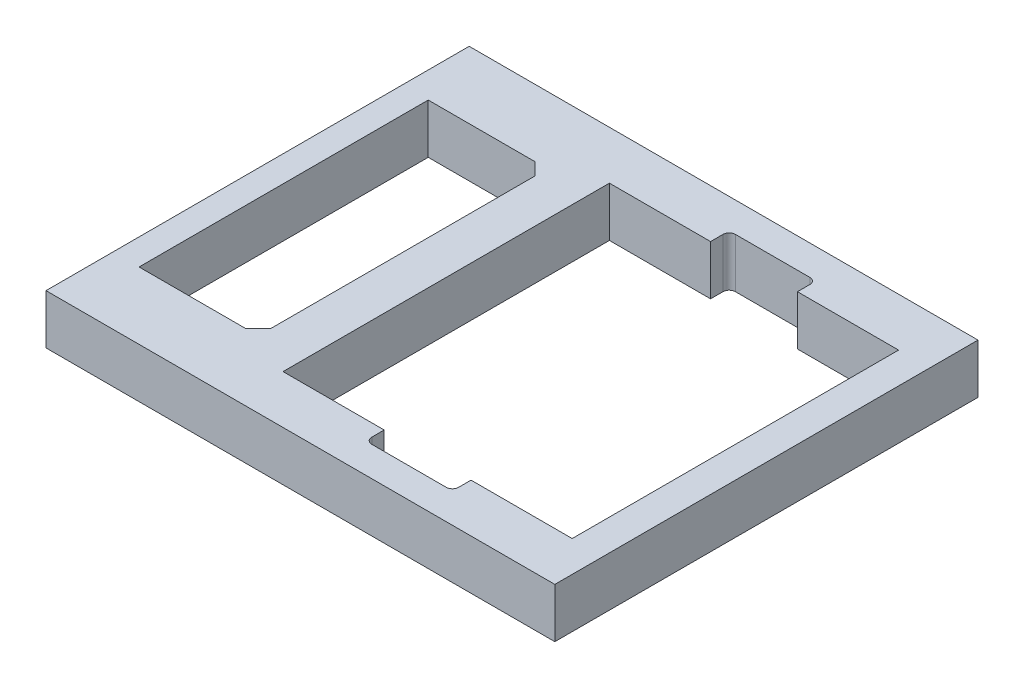
ISO-10303-21;
HEADER;
FILE_DESCRIPTION(('STEP AP214'),'2;1');
FILE_NAME('part.step','',(''),(''),'','','');
FILE_SCHEMA(('AUTOMOTIVE_DESIGN { 1 0 10303 214 1 1 1 1 }'));
ENDSEC;
DATA;
#1=APPLICATION_CONTEXT('core data for automotive mechanical design processes');
#2=APPLICATION_PROTOCOL_DEFINITION('international standard','automotive_design',2000,#1);
#3=PRODUCT_CONTEXT('',#1,'mechanical');
#4=PRODUCT('Part','Part','',(#3));
#5=PRODUCT_RELATED_PRODUCT_CATEGORY('part','',(#4));
#6=PRODUCT_DEFINITION_FORMATION('','',#4);
#7=PRODUCT_DEFINITION_CONTEXT('part definition',#1,'design');
#8=PRODUCT_DEFINITION('design','',#6,#7);
#9=PRODUCT_DEFINITION_SHAPE('','',#8);
#10=(LENGTH_UNIT() NAMED_UNIT(*) SI_UNIT(.MILLI.,.METRE.));
#11=(NAMED_UNIT(*) PLANE_ANGLE_UNIT() SI_UNIT($,.RADIAN.));
#12=(NAMED_UNIT(*) SI_UNIT($,.STERADIAN.) SOLID_ANGLE_UNIT());
#13=UNCERTAINTY_MEASURE_WITH_UNIT(LENGTH_MEASURE(1.E-05),#10,'distance_accuracy_value','');
#14=(GEOMETRIC_REPRESENTATION_CONTEXT(3) GLOBAL_UNCERTAINTY_ASSIGNED_CONTEXT((#13)) GLOBAL_UNIT_ASSIGNED_CONTEXT((#10,
#11,#12)) REPRESENTATION_CONTEXT('',''));
#15=CARTESIAN_POINT('',(0.,0.,0.));
#16=DIRECTION('',(0.,0.,1.));
#17=DIRECTION('',(1.,0.,0.));
#18=AXIS2_PLACEMENT_3D('',#15,#16,#17);
#19=CARTESIAN_POINT('',(0.,40.,0.));
#20=DIRECTION('',(0.,-1.,0.));
#21=DIRECTION('',(0.,0.,-1.));
#22=AXIS2_PLACEMENT_3D('',#19,#20,#21);
#23=PLANE('',#22);
#24=DIRECTION('',(0.,0.,1.));
#25=VECTOR('',#24,1.);
#26=CARTESIAN_POINT('',(-184.,40.,116.5));
#27=LINE('',#26,#25);
#28=CARTESIAN_POINT('',(-184.,40.,-116.5));
#29=VERTEX_POINT('',#28);
#30=CARTESIAN_POINT('',(-184.,40.,116.5));
#31=VERTEX_POINT('',#30);
#32=EDGE_CURVE('E327',#29,#31,#27,.T.);
#33=ORIENTED_EDGE('',*,*,#32,.F.);
#34=DIRECTION('',(-1.,0.,0.));
#35=VECTOR('',#34,1.);
#36=CARTESIAN_POINT('',(-184.,40.,-116.5));
#37=LINE('',#36,#35);
#38=CARTESIAN_POINT('',(-98.,40.,-116.5));
#39=VERTEX_POINT('',#38);
#40=EDGE_CURVE('E339',#39,#29,#37,.T.);
#41=ORIENTED_EDGE('',*,*,#40,.F.);
#42=DIRECTION('',(-0.707106781186547,0.,-0.707106781186547));
#43=VECTOR('',#42,1.);
#44=CARTESIAN_POINT('',(-98.,40.,-116.5));
#45=LINE('',#44,#43);
#46=CARTESIAN_POINT('',(-88.,40.,-106.5));
#47=VERTEX_POINT('',#46);
#48=EDGE_CURVE('E336',#47,#39,#45,.T.);
#49=ORIENTED_EDGE('',*,*,#48,.F.);
#50=DIRECTION('',(0.,0.,-1.));
#51=VECTOR('',#50,1.);
#52=CARTESIAN_POINT('',(-88.,40.,106.5));
#53=LINE('',#52,#51);
#54=CARTESIAN_POINT('',(-88.,40.,106.5));
#55=VERTEX_POINT('',#54);
#56=EDGE_CURVE('E334',#55,#47,#53,.T.);
#57=ORIENTED_EDGE('',*,*,#56,.F.);
#58=DIRECTION('',(0.707106781186547,0.,-0.707106781186547));
#59=VECTOR('',#58,1.);
#60=CARTESIAN_POINT('',(-98.,40.,116.5));
#61=LINE('',#60,#59);
#62=CARTESIAN_POINT('',(-98.,40.,116.5));
#63=VERTEX_POINT('',#62);
#64=EDGE_CURVE('E332',#63,#55,#61,.T.);
#65=ORIENTED_EDGE('',*,*,#64,.F.);
#66=DIRECTION('',(1.,0.,0.));
#67=VECTOR('',#66,1.);
#68=CARTESIAN_POINT('',(-184.,40.,116.5));
#69=LINE('',#68,#67);
#70=EDGE_CURVE('E329',#31,#63,#69,.T.);
#71=ORIENTED_EDGE('',*,*,#70,.F.);
#72=EDGE_LOOP('',(#33,#41,#49,#57,#65,#71));
#73=FACE_BOUND('',#72,.T.);
#74=DIRECTION('',(0.,0.,-1.));
#75=VECTOR('',#74,1.);
#76=CARTESIAN_POINT('',(205.,40.,170.5));
#77=LINE('',#76,#75);
#78=CARTESIAN_POINT('',(205.,40.,170.5));
#79=VERTEX_POINT('',#78);
#80=CARTESIAN_POINT('',(205.,40.,-170.5));
#81=VERTEX_POINT('',#80);
#82=EDGE_CURVE('E372',#79,#81,#77,.T.);
#83=ORIENTED_EDGE('',*,*,#82,.T.);
#84=DIRECTION('',(-1.,0.,0.));
#85=VECTOR('',#84,1.);
#86=CARTESIAN_POINT('',(-205.,40.,-170.5));
#87=LINE('',#86,#85);
#88=CARTESIAN_POINT('',(-205.,40.,-170.5));
#89=VERTEX_POINT('',#88);
#90=EDGE_CURVE('E375',#81,#89,#87,.T.);
#91=ORIENTED_EDGE('',*,*,#90,.T.);
#92=DIRECTION('',(0.,0.,1.));
#93=VECTOR('',#92,1.);
#94=CARTESIAN_POINT('',(-205.,40.,170.5));
#95=LINE('',#94,#93);
#96=CARTESIAN_POINT('',(-205.,40.,170.5));
#97=VERTEX_POINT('',#96);
#98=EDGE_CURVE('E378',#89,#97,#95,.T.);
#99=ORIENTED_EDGE('',*,*,#98,.T.);
#100=DIRECTION('',(1.,0.,0.));
#101=VECTOR('',#100,1.);
#102=CARTESIAN_POINT('',(-205.,40.,170.5));
#103=LINE('',#102,#101);
#104=EDGE_CURVE('E380',#97,#79,#103,.T.);
#105=ORIENTED_EDGE('',*,*,#104,.T.);
#106=EDGE_LOOP('',(#83,#91,#99,#105));
#107=FACE_BOUND('',#106,.T.);
#108=DIRECTION('',(0.,0.,1.));
#109=VECTOR('',#108,1.);
#110=CARTESIAN_POINT('',(-53.,40.,-131.5));
#111=LINE('',#110,#109);
#112=CARTESIAN_POINT('',(-53.,40.,-131.5));
#113=VERTEX_POINT('',#112);
#114=CARTESIAN_POINT('',(-53.,40.,131.5));
#115=VERTEX_POINT('',#114);
#116=EDGE_CURVE('E206',#113,#115,#111,.T.);
#117=ORIENTED_EDGE('',*,*,#116,.F.);
#118=DIRECTION('',(-1.,0.,0.));
#119=VECTOR('',#118,1.);
#120=CARTESIAN_POINT('',(-53.,40.,-131.5));
#121=LINE('',#120,#119);
#122=CARTESIAN_POINT('',(28.5,40.,-131.5));
#123=VERTEX_POINT('',#122);
#124=EDGE_CURVE('E255',#123,#113,#121,.T.);
#125=ORIENTED_EDGE('',*,*,#124,.F.);
#126=DIRECTION('',(0.,0.,1.));
#127=VECTOR('',#126,1.);
#128=CARTESIAN_POINT('',(28.5,40.,-131.5));
#129=LINE('',#128,#127);
#130=CARTESIAN_POINT('',(28.5,40.,-141.5));
#131=VERTEX_POINT('',#130);
#132=EDGE_CURVE('E253',#131,#123,#129,.T.);
#133=ORIENTED_EDGE('',*,*,#132,.F.);
#134=CARTESIAN_POINT('',(33.5,40.,-141.5));
#135=DIRECTION('',(0.,1.,0.));
#136=DIRECTION('',(0.,0.,-1.));
#137=AXIS2_PLACEMENT_3D('',#134,#135,#136);
#138=CIRCLE('',#137,5.);
#139=CARTESIAN_POINT('',(33.5000000000001,40.,-146.5));
#140=VERTEX_POINT('',#139);
#141=EDGE_CURVE('E251',#140,#131,#138,.T.);
#142=ORIENTED_EDGE('',*,*,#141,.F.);
#143=DIRECTION('',(-1.,0.,0.));
#144=VECTOR('',#143,1.);
#145=CARTESIAN_POINT('',(33.5000000000001,40.,-146.5));
#146=LINE('',#145,#144);
#147=CARTESIAN_POINT('',(93.5,40.,-146.5));
#148=VERTEX_POINT('',#147);
#149=EDGE_CURVE('E249',#148,#140,#146,.T.);
#150=ORIENTED_EDGE('',*,*,#149,.F.);
#151=CARTESIAN_POINT('',(93.5,40.,-141.5));
#152=DIRECTION('',(0.,1.,0.));
#153=DIRECTION('',(0.,0.,-1.));
#154=AXIS2_PLACEMENT_3D('',#151,#152,#153);
#155=CIRCLE('',#154,5.);
#156=CARTESIAN_POINT('',(98.5,40.,-141.5));
#157=VERTEX_POINT('',#156);
#158=EDGE_CURVE('E247',#157,#148,#155,.T.);
#159=ORIENTED_EDGE('',*,*,#158,.F.);
#160=DIRECTION('',(0.,0.,-1.));
#161=VECTOR('',#160,1.);
#162=CARTESIAN_POINT('',(98.5,40.,-141.5));
#163=LINE('',#162,#161);
#164=CARTESIAN_POINT('',(98.5,40.,-131.5));
#165=VERTEX_POINT('',#164);
#166=EDGE_CURVE('E245',#165,#157,#163,.T.);
#167=ORIENTED_EDGE('',*,*,#166,.F.);
#168=DIRECTION('',(-1.,0.,0.));
#169=VECTOR('',#168,1.);
#170=CARTESIAN_POINT('',(98.5,40.,-131.5));
#171=LINE('',#170,#169);
#172=CARTESIAN_POINT('',(180.,40.,-131.5));
#173=VERTEX_POINT('',#172);
#174=EDGE_CURVE('E243',#173,#165,#171,.T.);
#175=ORIENTED_EDGE('',*,*,#174,.F.);
#176=DIRECTION('',(0.,0.,-1.));
#177=VECTOR('',#176,1.);
#178=CARTESIAN_POINT('',(180.,40.,-131.5));
#179=LINE('',#178,#177);
#180=CARTESIAN_POINT('',(180.,40.,131.5));
#181=VERTEX_POINT('',#180);
#182=EDGE_CURVE('E241',#181,#173,#179,.T.);
#183=ORIENTED_EDGE('',*,*,#182,.F.);
#184=DIRECTION('',(1.,0.,0.));
#185=VECTOR('',#184,1.);
#186=CARTESIAN_POINT('',(98.5,40.,131.5));
#187=LINE('',#186,#185);
#188=CARTESIAN_POINT('',(98.5,40.,131.5));
#189=VERTEX_POINT('',#188);
#190=EDGE_CURVE('E239',#189,#181,#187,.T.);
#191=ORIENTED_EDGE('',*,*,#190,.F.);
#192=DIRECTION('',(0.,0.,-1.));
#193=VECTOR('',#192,1.);
#194=CARTESIAN_POINT('',(98.5,40.,141.5));
#195=LINE('',#194,#193);
#196=CARTESIAN_POINT('',(98.5,40.,141.5));
#197=VERTEX_POINT('',#196);
#198=EDGE_CURVE('E237',#197,#189,#195,.T.);
#199=ORIENTED_EDGE('',*,*,#198,.F.);
#200=CARTESIAN_POINT('',(93.5,40.,141.5));
#201=DIRECTION('',(0.,1.,0.));
#202=DIRECTION('',(0.,0.,-1.));
#203=AXIS2_PLACEMENT_3D('',#200,#201,#202);
#204=CIRCLE('',#203,5.);
#205=CARTESIAN_POINT('',(93.5,40.,146.5));
#206=VERTEX_POINT('',#205);
#207=EDGE_CURVE('E235',#206,#197,#204,.T.);
#208=ORIENTED_EDGE('',*,*,#207,.F.);
#209=DIRECTION('',(1.,0.,0.));
#210=VECTOR('',#209,1.);
#211=CARTESIAN_POINT('',(33.5000000000001,40.,146.5));
#212=LINE('',#211,#210);
#213=CARTESIAN_POINT('',(33.5000000000001,40.,146.5));
#214=VERTEX_POINT('',#213);
#215=EDGE_CURVE('E233',#214,#206,#212,.T.);
#216=ORIENTED_EDGE('',*,*,#215,.F.);
#217=CARTESIAN_POINT('',(33.5,40.,141.5));
#218=DIRECTION('',(0.,1.,0.));
#219=DIRECTION('',(0.,0.,-1.));
#220=AXIS2_PLACEMENT_3D('',#217,#218,#219);
#221=CIRCLE('',#220,5.);
#222=CARTESIAN_POINT('',(28.5,40.,141.5));
#223=VERTEX_POINT('',#222);
#224=EDGE_CURVE('E229',#223,#214,#221,.T.);
#225=ORIENTED_EDGE('',*,*,#224,.F.);
#226=DIRECTION('',(0.,0.,1.));
#227=VECTOR('',#226,1.);
#228=CARTESIAN_POINT('',(28.5,40.,131.5));
#229=LINE('',#228,#227);
#230=CARTESIAN_POINT('',(28.5,40.,131.5));
#231=VERTEX_POINT('',#230);
#232=EDGE_CURVE('E227',#231,#223,#229,.T.);
#233=ORIENTED_EDGE('',*,*,#232,.F.);
#234=DIRECTION('',(1.,0.,0.));
#235=VECTOR('',#234,1.);
#236=CARTESIAN_POINT('',(-53.,40.,131.5));
#237=LINE('',#236,#235);
#238=EDGE_CURVE('E214',#115,#231,#237,.T.);
#239=ORIENTED_EDGE('',*,*,#238,.F.);
#240=EDGE_LOOP('',(#117,#125,#133,#142,#150,#159,#167,#175,#183,#191,#199,#208,#216,#225,#233,#239));
#241=FACE_BOUND('',#240,.T.);
#242=ADVANCED_FACE('F33',(#73,#107,#241),#23,.F.);
#243=CARTESIAN_POINT('',(0.,0.,0.));
#244=DIRECTION('',(0.,-1.,0.));
#245=DIRECTION('',(0.,0.,-1.));
#246=AXIS2_PLACEMENT_3D('',#243,#244,#245);
#247=PLANE('',#246);
#248=DIRECTION('',(-1.,0.,0.));
#249=VECTOR('',#248,1.);
#250=CARTESIAN_POINT('',(-184.,0.,-116.5));
#251=LINE('',#250,#249);
#252=CARTESIAN_POINT('',(-98.,0.,-116.5));
#253=VERTEX_POINT('',#252);
#254=CARTESIAN_POINT('',(-184.,0.,-116.5));
#255=VERTEX_POINT('',#254);
#256=EDGE_CURVE('E330',#253,#255,#251,.T.);
#257=ORIENTED_EDGE('',*,*,#256,.T.);
#258=DIRECTION('',(0.,0.,1.));
#259=VECTOR('',#258,1.);
#260=CARTESIAN_POINT('',(-184.,0.,116.5));
#261=LINE('',#260,#259);
#262=CARTESIAN_POINT('',(-184.,0.,116.5));
#263=VERTEX_POINT('',#262);
#264=EDGE_CURVE('E222',#255,#263,#261,.T.);
#265=ORIENTED_EDGE('',*,*,#264,.T.);
#266=DIRECTION('',(1.,0.,0.));
#267=VECTOR('',#266,1.);
#268=CARTESIAN_POINT('',(-184.,0.,116.5));
#269=LINE('',#268,#267);
#270=CARTESIAN_POINT('',(-98.,0.,116.5));
#271=VERTEX_POINT('',#270);
#272=EDGE_CURVE('E344',#263,#271,#269,.T.);
#273=ORIENTED_EDGE('',*,*,#272,.T.);
#274=DIRECTION('',(0.707106781186547,0.,-0.707106781186547));
#275=VECTOR('',#274,1.);
#276=CARTESIAN_POINT('',(-98.,0.,116.5));
#277=LINE('',#276,#275);
#278=CARTESIAN_POINT('',(-88.,0.,106.5));
#279=VERTEX_POINT('',#278);
#280=EDGE_CURVE('E347',#271,#279,#277,.T.);
#281=ORIENTED_EDGE('',*,*,#280,.T.);
#282=DIRECTION('',(0.,0.,-1.));
#283=VECTOR('',#282,1.);
#284=CARTESIAN_POINT('',(-88.,0.,106.5));
#285=LINE('',#284,#283);
#286=CARTESIAN_POINT('',(-88.,0.,-106.5));
#287=VERTEX_POINT('',#286);
#288=EDGE_CURVE('E350',#279,#287,#285,.T.);
#289=ORIENTED_EDGE('',*,*,#288,.T.);
#290=DIRECTION('',(-0.707106781186547,0.,-0.707106781186547));
#291=VECTOR('',#290,1.);
#292=CARTESIAN_POINT('',(-98.,0.,-116.5));
#293=LINE('',#292,#291);
#294=EDGE_CURVE('E353',#287,#253,#293,.T.);
#295=ORIENTED_EDGE('',*,*,#294,.T.);
#296=EDGE_LOOP('',(#257,#265,#273,#281,#289,#295));
#297=FACE_BOUND('',#296,.T.);
#298=DIRECTION('',(0.,0.,-1.));
#299=VECTOR('',#298,1.);
#300=CARTESIAN_POINT('',(205.,0.,170.5));
#301=LINE('',#300,#299);
#302=CARTESIAN_POINT('',(205.,0.,170.5));
#303=VERTEX_POINT('',#302);
#304=CARTESIAN_POINT('',(205.,0.,-170.5));
#305=VERTEX_POINT('',#304);
#306=EDGE_CURVE('E371',#303,#305,#301,.T.);
#307=ORIENTED_EDGE('',*,*,#306,.F.);
#308=DIRECTION('',(1.,0.,0.));
#309=VECTOR('',#308,1.);
#310=CARTESIAN_POINT('',(-205.,0.,170.5));
#311=LINE('',#310,#309);
#312=CARTESIAN_POINT('',(-205.,0.,170.5));
#313=VERTEX_POINT('',#312);
#314=EDGE_CURVE('E376',#313,#303,#311,.T.);
#315=ORIENTED_EDGE('',*,*,#314,.F.);
#316=DIRECTION('',(0.,0.,1.));
#317=VECTOR('',#316,1.);
#318=CARTESIAN_POINT('',(-205.,0.,170.5));
#319=LINE('',#318,#317);
#320=CARTESIAN_POINT('',(-205.,0.,-170.5));
#321=VERTEX_POINT('',#320);
#322=EDGE_CURVE('E387',#321,#313,#319,.T.);
#323=ORIENTED_EDGE('',*,*,#322,.F.);
#324=DIRECTION('',(-1.,0.,0.));
#325=VECTOR('',#324,1.);
#326=CARTESIAN_POINT('',(-205.,0.,-170.5));
#327=LINE('',#326,#325);
#328=EDGE_CURVE('E385',#305,#321,#327,.T.);
#329=ORIENTED_EDGE('',*,*,#328,.F.);
#330=EDGE_LOOP('',(#307,#315,#323,#329));
#331=FACE_BOUND('',#330,.T.);
#332=DIRECTION('',(-1.,0.,0.));
#333=VECTOR('',#332,1.);
#334=CARTESIAN_POINT('',(-53.,0.,-131.5));
#335=LINE('',#334,#333);
#336=CARTESIAN_POINT('',(28.5,0.,-131.5));
#337=VERTEX_POINT('',#336);
#338=CARTESIAN_POINT('',(-53.,0.,-131.5));
#339=VERTEX_POINT('',#338);
#340=EDGE_CURVE('E215',#337,#339,#335,.T.);
#341=ORIENTED_EDGE('',*,*,#340,.T.);
#342=DIRECTION('',(0.,0.,1.));
#343=VECTOR('',#342,1.);
#344=CARTESIAN_POINT('',(-53.,0.,-131.5));
#345=LINE('',#344,#343);
#346=CARTESIAN_POINT('',(-53.,0.,131.5));
#347=VERTEX_POINT('',#346);
#348=EDGE_CURVE('E56',#339,#347,#345,.T.);
#349=ORIENTED_EDGE('',*,*,#348,.T.);
#350=DIRECTION('',(1.,0.,0.));
#351=VECTOR('',#350,1.);
#352=CARTESIAN_POINT('',(-53.,0.,131.5));
#353=LINE('',#352,#351);
#354=CARTESIAN_POINT('',(28.5,0.,131.5));
#355=VERTEX_POINT('',#354);
#356=EDGE_CURVE('E221',#347,#355,#353,.T.);
#357=ORIENTED_EDGE('',*,*,#356,.T.);
#358=DIRECTION('',(0.,0.,1.));
#359=VECTOR('',#358,1.);
#360=CARTESIAN_POINT('',(28.5,0.,131.5));
#361=LINE('',#360,#359);
#362=CARTESIAN_POINT('',(28.5,0.,141.5));
#363=VERTEX_POINT('',#362);
#364=EDGE_CURVE('E259',#355,#363,#361,.T.);
#365=ORIENTED_EDGE('',*,*,#364,.T.);
#366=CARTESIAN_POINT('',(33.5,0.,141.5));
#367=DIRECTION('',(0.,1.,0.));
#368=DIRECTION('',(0.,0.,-1.));
#369=AXIS2_PLACEMENT_3D('',#366,#367,#368);
#370=CIRCLE('',#369,5.);
#371=CARTESIAN_POINT('',(33.5000000000001,0.,146.5));
#372=VERTEX_POINT('',#371);
#373=EDGE_CURVE('E262',#363,#372,#370,.T.);
#374=ORIENTED_EDGE('',*,*,#373,.T.);
#375=DIRECTION('',(1.,0.,0.));
#376=VECTOR('',#375,1.);
#377=CARTESIAN_POINT('',(33.5000000000001,0.,146.5));
#378=LINE('',#377,#376);
#379=CARTESIAN_POINT('',(93.5,0.,146.5));
#380=VERTEX_POINT('',#379);
#381=EDGE_CURVE('E265',#372,#380,#378,.T.);
#382=ORIENTED_EDGE('',*,*,#381,.T.);
#383=CARTESIAN_POINT('',(93.5,0.,141.5));
#384=DIRECTION('',(0.,1.,0.));
#385=DIRECTION('',(0.,0.,-1.));
#386=AXIS2_PLACEMENT_3D('',#383,#384,#385);
#387=CIRCLE('',#386,5.);
#388=CARTESIAN_POINT('',(98.5,0.,141.5));
#389=VERTEX_POINT('',#388);
#390=EDGE_CURVE('E268',#380,#389,#387,.T.);
#391=ORIENTED_EDGE('',*,*,#390,.T.);
#392=DIRECTION('',(0.,0.,-1.));
#393=VECTOR('',#392,1.);
#394=CARTESIAN_POINT('',(98.5,0.,141.5));
#395=LINE('',#394,#393);
#396=CARTESIAN_POINT('',(98.5,0.,131.5));
#397=VERTEX_POINT('',#396);
#398=EDGE_CURVE('E271',#389,#397,#395,.T.);
#399=ORIENTED_EDGE('',*,*,#398,.T.);
#400=DIRECTION('',(1.,0.,0.));
#401=VECTOR('',#400,1.);
#402=CARTESIAN_POINT('',(98.5,0.,131.5));
#403=LINE('',#402,#401);
#404=CARTESIAN_POINT('',(180.,0.,131.5));
#405=VERTEX_POINT('',#404);
#406=EDGE_CURVE('E274',#397,#405,#403,.T.);
#407=ORIENTED_EDGE('',*,*,#406,.T.);
#408=DIRECTION('',(0.,0.,-1.));
#409=VECTOR('',#408,1.);
#410=CARTESIAN_POINT('',(180.,0.,-131.5));
#411=LINE('',#410,#409);
#412=CARTESIAN_POINT('',(180.,0.,-131.5));
#413=VERTEX_POINT('',#412);
#414=EDGE_CURVE('E277',#405,#413,#411,.T.);
#415=ORIENTED_EDGE('',*,*,#414,.T.);
#416=DIRECTION('',(-1.,0.,0.));
#417=VECTOR('',#416,1.);
#418=CARTESIAN_POINT('',(98.5,0.,-131.5));
#419=LINE('',#418,#417);
#420=CARTESIAN_POINT('',(98.5,0.,-131.5));
#421=VERTEX_POINT('',#420);
#422=EDGE_CURVE('E280',#413,#421,#419,.T.);
#423=ORIENTED_EDGE('',*,*,#422,.T.);
#424=DIRECTION('',(0.,0.,-1.));
#425=VECTOR('',#424,1.);
#426=CARTESIAN_POINT('',(98.5,0.,-141.5));
#427=LINE('',#426,#425);
#428=CARTESIAN_POINT('',(98.5,0.,-141.5));
#429=VERTEX_POINT('',#428);
#430=EDGE_CURVE('E283',#421,#429,#427,.T.);
#431=ORIENTED_EDGE('',*,*,#430,.T.);
#432=CARTESIAN_POINT('',(93.5,0.,-141.5));
#433=DIRECTION('',(0.,1.,0.));
#434=DIRECTION('',(0.,0.,-1.));
#435=AXIS2_PLACEMENT_3D('',#432,#433,#434);
#436=CIRCLE('',#435,5.);
#437=CARTESIAN_POINT('',(93.5,0.,-146.5));
#438=VERTEX_POINT('',#437);
#439=EDGE_CURVE('E286',#429,#438,#436,.T.);
#440=ORIENTED_EDGE('',*,*,#439,.T.);
#441=DIRECTION('',(-1.,0.,0.));
#442=VECTOR('',#441,1.);
#443=CARTESIAN_POINT('',(33.5000000000001,0.,-146.5));
#444=LINE('',#443,#442);
#445=CARTESIAN_POINT('',(33.5000000000001,0.,-146.5));
#446=VERTEX_POINT('',#445);
#447=EDGE_CURVE('E289',#438,#446,#444,.T.);
#448=ORIENTED_EDGE('',*,*,#447,.T.);
#449=CARTESIAN_POINT('',(33.5,0.,-141.5));
#450=DIRECTION('',(0.,1.,0.));
#451=DIRECTION('',(0.,0.,-1.));
#452=AXIS2_PLACEMENT_3D('',#449,#450,#451);
#453=CIRCLE('',#452,5.);
#454=CARTESIAN_POINT('',(28.5,0.,-141.5));
#455=VERTEX_POINT('',#454);
#456=EDGE_CURVE('E292',#446,#455,#453,.T.);
#457=ORIENTED_EDGE('',*,*,#456,.T.);
#458=DIRECTION('',(0.,0.,1.));
#459=VECTOR('',#458,1.);
#460=CARTESIAN_POINT('',(28.5,0.,-131.5));
#461=LINE('',#460,#459);
#462=EDGE_CURVE('E295',#455,#337,#461,.T.);
#463=ORIENTED_EDGE('',*,*,#462,.T.);
#464=EDGE_LOOP('',(#341,#349,#357,#365,#374,#382,#391,#399,#407,#415,#423,#431,#440,#448,#457,#463));
#465=FACE_BOUND('',#464,.T.);
#466=ADVANCED_FACE('F405',(#297,#331,#465),#247,.T.);
#467=CARTESIAN_POINT('',(205.,40.,170.5));
#468=DIRECTION('',(-1.,0.,0.));
#469=DIRECTION('',(0.,0.,1.));
#470=AXIS2_PLACEMENT_3D('',#467,#468,#469);
#471=PLANE('',#470);
#472=ORIENTED_EDGE('',*,*,#306,.T.);
#473=DIRECTION('',(0.,-1.,0.));
#474=VECTOR('',#473,1.);
#475=CARTESIAN_POINT('',(205.,40.,-170.5));
#476=LINE('',#475,#474);
#477=EDGE_CURVE('E11',#81,#305,#476,.T.);
#478=ORIENTED_EDGE('',*,*,#477,.F.);
#479=ORIENTED_EDGE('',*,*,#82,.F.);
#480=DIRECTION('',(0.,-1.,0.));
#481=VECTOR('',#480,1.);
#482=CARTESIAN_POINT('',(205.,40.,170.5));
#483=LINE('',#482,#481);
#484=EDGE_CURVE('E382',#79,#303,#483,.T.);
#485=ORIENTED_EDGE('',*,*,#484,.T.);
#486=EDGE_LOOP('',(#472,#478,#479,#485));
#487=FACE_BOUND('',#486,.T.);
#488=ADVANCED_FACE('F35',(#487),#471,.F.);
#489=CARTESIAN_POINT('',(-205.,40.,-170.5));
#490=DIRECTION('',(0.,0.,1.));
#491=DIRECTION('',(1.,0.,0.));
#492=AXIS2_PLACEMENT_3D('',#489,#490,#491);
#493=PLANE('',#492);
#494=ORIENTED_EDGE('',*,*,#328,.T.);
#495=DIRECTION('',(0.,-1.,0.));
#496=VECTOR('',#495,1.);
#497=CARTESIAN_POINT('',(-205.,40.,-170.5));
#498=LINE('',#497,#496);
#499=EDGE_CURVE('E41',#89,#321,#498,.T.);
#500=ORIENTED_EDGE('',*,*,#499,.F.);
#501=ORIENTED_EDGE('',*,*,#90,.F.);
#502=ORIENTED_EDGE('',*,*,#477,.T.);
#503=EDGE_LOOP('',(#494,#500,#501,#502));
#504=FACE_BOUND('',#503,.T.);
#505=ADVANCED_FACE('F415',(#504),#493,.F.);
#506=CARTESIAN_POINT('',(-205.,40.,170.5));
#507=DIRECTION('',(1.,0.,0.));
#508=DIRECTION('',(0.,0.,-1.));
#509=AXIS2_PLACEMENT_3D('',#506,#507,#508);
#510=PLANE('',#509);
#511=ORIENTED_EDGE('',*,*,#322,.T.);
#512=DIRECTION('',(0.,-1.,0.));
#513=VECTOR('',#512,1.);
#514=CARTESIAN_POINT('',(-205.,40.,170.5));
#515=LINE('',#514,#513);
#516=EDGE_CURVE('E392',#97,#313,#515,.T.);
#517=ORIENTED_EDGE('',*,*,#516,.F.);
#518=ORIENTED_EDGE('',*,*,#98,.F.);
#519=ORIENTED_EDGE('',*,*,#499,.T.);
#520=EDGE_LOOP('',(#511,#517,#518,#519));
#521=FACE_BOUND('',#520,.T.);
#522=ADVANCED_FACE('F399',(#521),#510,.F.);
#523=CARTESIAN_POINT('',(-205.,40.,170.5));
#524=DIRECTION('',(0.,0.,-1.));
#525=DIRECTION('',(-1.,0.,0.));
#526=AXIS2_PLACEMENT_3D('',#523,#524,#525);
#527=PLANE('',#526);
#528=ORIENTED_EDGE('',*,*,#314,.T.);
#529=ORIENTED_EDGE('',*,*,#484,.F.);
#530=ORIENTED_EDGE('',*,*,#104,.F.);
#531=ORIENTED_EDGE('',*,*,#516,.T.);
#532=EDGE_LOOP('',(#528,#529,#530,#531));
#533=FACE_BOUND('',#532,.T.);
#534=ADVANCED_FACE('F409',(#533),#527,.F.);
#535=CARTESIAN_POINT('',(-184.,40.,116.5));
#536=DIRECTION('',(1.,0.,0.));
#537=DIRECTION('',(0.,0.,-1.));
#538=AXIS2_PLACEMENT_3D('',#535,#536,#537);
#539=PLANE('',#538);
#540=ORIENTED_EDGE('',*,*,#264,.F.);
#541=DIRECTION('',(0.,-1.,0.));
#542=VECTOR('',#541,1.);
#543=CARTESIAN_POINT('',(-184.,40.,-116.5));
#544=LINE('',#543,#542);
#545=EDGE_CURVE('E341',#29,#255,#544,.T.);
#546=ORIENTED_EDGE('',*,*,#545,.F.);
#547=ORIENTED_EDGE('',*,*,#32,.T.);
#548=DIRECTION('',(0.,-1.,0.));
#549=VECTOR('',#548,1.);
#550=CARTESIAN_POINT('',(-184.,40.,116.5));
#551=LINE('',#550,#549);
#552=EDGE_CURVE('E368',#31,#263,#551,.T.);
#553=ORIENTED_EDGE('',*,*,#552,.T.);
#554=EDGE_LOOP('',(#540,#546,#547,#553));
#555=FACE_BOUND('',#554,.T.);
#556=ADVANCED_FACE('F432',(#555),#539,.T.);
#557=CARTESIAN_POINT('',(-184.,40.,116.5));
#558=DIRECTION('',(0.,0.,-1.));
#559=DIRECTION('',(-1.,0.,0.));
#560=AXIS2_PLACEMENT_3D('',#557,#558,#559);
#561=PLANE('',#560);
#562=ORIENTED_EDGE('',*,*,#272,.F.);
#563=ORIENTED_EDGE('',*,*,#552,.F.);
#564=ORIENTED_EDGE('',*,*,#70,.T.);
#565=DIRECTION('',(0.,-1.,0.));
#566=VECTOR('',#565,1.);
#567=CARTESIAN_POINT('',(-98.,40.,116.5));
#568=LINE('',#567,#566);
#569=EDGE_CURVE('E366',#63,#271,#568,.T.);
#570=ORIENTED_EDGE('',*,*,#569,.T.);
#571=EDGE_LOOP('',(#562,#563,#564,#570));
#572=FACE_BOUND('',#571,.T.);
#573=ADVANCED_FACE('F439',(#572),#561,.T.);
#574=CARTESIAN_POINT('',(-98.,40.,116.5));
#575=DIRECTION('',(-0.707106781186548,0.,-0.707106781186548));
#576=DIRECTION('',(-0.707106781186548,0.,0.707106781186548));
#577=AXIS2_PLACEMENT_3D('',#574,#575,#576);
#578=PLANE('',#577);
#579=ORIENTED_EDGE('',*,*,#280,.F.);
#580=ORIENTED_EDGE('',*,*,#569,.F.);
#581=ORIENTED_EDGE('',*,*,#64,.T.);
#582=DIRECTION('',(0.,-1.,0.));
#583=VECTOR('',#582,1.);
#584=CARTESIAN_POINT('',(-88.,40.,106.5));
#585=LINE('',#584,#583);
#586=EDGE_CURVE('E364',#55,#279,#585,.T.);
#587=ORIENTED_EDGE('',*,*,#586,.T.);
#588=EDGE_LOOP('',(#579,#580,#581,#587));
#589=FACE_BOUND('',#588,.T.);
#590=ADVANCED_FACE('F444',(#589),#578,.T.);
#591=CARTESIAN_POINT('',(-88.,40.,106.5));
#592=DIRECTION('',(-1.,0.,0.));
#593=DIRECTION('',(0.,0.,1.));
#594=AXIS2_PLACEMENT_3D('',#591,#592,#593);
#595=PLANE('',#594);
#596=ORIENTED_EDGE('',*,*,#288,.F.);
#597=ORIENTED_EDGE('',*,*,#586,.F.);
#598=ORIENTED_EDGE('',*,*,#56,.T.);
#599=DIRECTION('',(0.,-1.,0.));
#600=VECTOR('',#599,1.);
#601=CARTESIAN_POINT('',(-88.,40.,-106.5));
#602=LINE('',#601,#600);
#603=EDGE_CURVE('E362',#47,#287,#602,.T.);
#604=ORIENTED_EDGE('',*,*,#603,.T.);
#605=EDGE_LOOP('',(#596,#597,#598,#604));
#606=FACE_BOUND('',#605,.T.);
#607=ADVANCED_FACE('F466',(#606),#595,.T.);
#608=CARTESIAN_POINT('',(-98.,40.,-116.5));
#609=DIRECTION('',(-0.707106781186548,0.,0.707106781186548));
#610=DIRECTION('',(0.707106781186548,0.,0.707106781186548));
#611=AXIS2_PLACEMENT_3D('',#608,#609,#610);
#612=PLANE('',#611);
#613=ORIENTED_EDGE('',*,*,#294,.F.);
#614=ORIENTED_EDGE('',*,*,#603,.F.);
#615=ORIENTED_EDGE('',*,*,#48,.T.);
#616=DIRECTION('',(0.,-1.,0.));
#617=VECTOR('',#616,1.);
#618=CARTESIAN_POINT('',(-98.,40.,-116.5));
#619=LINE('',#618,#617);
#620=EDGE_CURVE('E360',#39,#253,#619,.T.);
#621=ORIENTED_EDGE('',*,*,#620,.T.);
#622=EDGE_LOOP('',(#613,#614,#615,#621));
#623=FACE_BOUND('',#622,.T.);
#624=ADVANCED_FACE('F456',(#623),#612,.T.);
#625=CARTESIAN_POINT('',(-184.,40.,-116.5));
#626=DIRECTION('',(0.,0.,1.));
#627=DIRECTION('',(1.,0.,0.));
#628=AXIS2_PLACEMENT_3D('',#625,#626,#627);
#629=PLANE('',#628);
#630=ORIENTED_EDGE('',*,*,#256,.F.);
#631=ORIENTED_EDGE('',*,*,#620,.F.);
#632=ORIENTED_EDGE('',*,*,#40,.T.);
#633=ORIENTED_EDGE('',*,*,#545,.T.);
#634=EDGE_LOOP('',(#630,#631,#632,#633));
#635=FACE_BOUND('',#634,.T.);
#636=ADVANCED_FACE('F450',(#635),#629,.T.);
#637=CARTESIAN_POINT('',(-53.,40.,-131.5));
#638=DIRECTION('',(1.,0.,0.));
#639=DIRECTION('',(0.,0.,-1.));
#640=AXIS2_PLACEMENT_3D('',#637,#638,#639);
#641=PLANE('',#640);
#642=ORIENTED_EDGE('',*,*,#348,.F.);
#643=DIRECTION('',(0.,-1.,0.));
#644=VECTOR('',#643,1.);
#645=CARTESIAN_POINT('',(-53.,40.,-131.5));
#646=LINE('',#645,#644);
#647=EDGE_CURVE('E210',#113,#339,#646,.T.);
#648=ORIENTED_EDGE('',*,*,#647,.F.);
#649=ORIENTED_EDGE('',*,*,#116,.T.);
#650=DIRECTION('',(0.,-1.,0.));
#651=VECTOR('',#650,1.);
#652=CARTESIAN_POINT('',(-53.,40.,131.5));
#653=LINE('',#652,#651);
#654=EDGE_CURVE('E209',#115,#347,#653,.T.);
#655=ORIENTED_EDGE('',*,*,#654,.T.);
#656=EDGE_LOOP('',(#642,#648,#649,#655));
#657=FACE_BOUND('',#656,.T.);
#658=ADVANCED_FACE('F208',(#657),#641,.T.);
#659=CARTESIAN_POINT('',(-53.,40.,131.5));
#660=DIRECTION('',(0.,0.,-1.));
#661=DIRECTION('',(-1.,0.,0.));
#662=AXIS2_PLACEMENT_3D('',#659,#660,#661);
#663=PLANE('',#662);
#664=ORIENTED_EDGE('',*,*,#356,.F.);
#665=ORIENTED_EDGE('',*,*,#654,.F.);
#666=ORIENTED_EDGE('',*,*,#238,.T.);
#667=DIRECTION('',(0.,-1.,0.));
#668=VECTOR('',#667,1.);
#669=CARTESIAN_POINT('',(28.5,40.,131.5));
#670=LINE('',#669,#668);
#671=EDGE_CURVE('E223',#231,#355,#670,.T.);
#672=ORIENTED_EDGE('',*,*,#671,.T.);
#673=EDGE_LOOP('',(#664,#665,#666,#672));
#674=FACE_BOUND('',#673,.T.);
#675=ADVANCED_FACE('F218',(#674),#663,.T.);
#676=CARTESIAN_POINT('',(28.5,40.,131.5));
#677=DIRECTION('',(1.,0.,0.));
#678=DIRECTION('',(0.,0.,-1.));
#679=AXIS2_PLACEMENT_3D('',#676,#677,#678);
#680=PLANE('',#679);
#681=ORIENTED_EDGE('',*,*,#364,.F.);
#682=ORIENTED_EDGE('',*,*,#671,.F.);
#683=ORIENTED_EDGE('',*,*,#232,.T.);
#684=DIRECTION('',(0.,-1.,0.));
#685=VECTOR('',#684,1.);
#686=CARTESIAN_POINT('',(28.5,40.,141.5));
#687=LINE('',#686,#685);
#688=EDGE_CURVE('E324',#223,#363,#687,.T.);
#689=ORIENTED_EDGE('',*,*,#688,.T.);
#690=EDGE_LOOP('',(#681,#682,#683,#689));
#691=FACE_BOUND('',#690,.T.);
#692=ADVANCED_FACE('F482',(#691),#680,.T.);
#693=CARTESIAN_POINT('',(33.5,40.,141.5));
#694=DIRECTION('',(0.,-1.,0.));
#695=DIRECTION('',(0.,0.,-1.));
#696=AXIS2_PLACEMENT_3D('',#693,#694,#695);
#697=CYLINDRICAL_SURFACE('',#696,5.);
#698=ORIENTED_EDGE('',*,*,#373,.F.);
#699=ORIENTED_EDGE('',*,*,#688,.F.);
#700=ORIENTED_EDGE('',*,*,#224,.T.);
#701=DIRECTION('',(0.,-1.,0.));
#702=VECTOR('',#701,1.);
#703=CARTESIAN_POINT('',(33.5000000000001,40.,146.5));
#704=LINE('',#703,#702);
#705=EDGE_CURVE('E322',#214,#372,#704,.T.);
#706=ORIENTED_EDGE('',*,*,#705,.T.);
#707=EDGE_LOOP('',(#698,#699,#700,#706));
#708=FACE_BOUND('',#707,.T.);
#709=ADVANCED_FACE('F485',(#708),#697,.F.);
#710=CARTESIAN_POINT('',(33.5000000000001,40.,146.5));
#711=DIRECTION('',(0.,0.,-1.));
#712=DIRECTION('',(-1.,0.,0.));
#713=AXIS2_PLACEMENT_3D('',#710,#711,#712);
#714=PLANE('',#713);
#715=ORIENTED_EDGE('',*,*,#381,.F.);
#716=ORIENTED_EDGE('',*,*,#705,.F.);
#717=ORIENTED_EDGE('',*,*,#215,.T.);
#718=DIRECTION('',(0.,-1.,0.));
#719=VECTOR('',#718,1.);
#720=CARTESIAN_POINT('',(93.5,40.,146.5));
#721=LINE('',#720,#719);
#722=EDGE_CURVE('E320',#206,#380,#721,.T.);
#723=ORIENTED_EDGE('',*,*,#722,.T.);
#724=EDGE_LOOP('',(#715,#716,#717,#723));
#725=FACE_BOUND('',#724,.T.);
#726=ADVANCED_FACE('F489',(#725),#714,.T.);
#727=CARTESIAN_POINT('',(93.5,40.,141.5));
#728=DIRECTION('',(0.,-1.,0.));
#729=DIRECTION('',(0.,0.,-1.));
#730=AXIS2_PLACEMENT_3D('',#727,#728,#729);
#731=CYLINDRICAL_SURFACE('',#730,5.);
#732=ORIENTED_EDGE('',*,*,#390,.F.);
#733=ORIENTED_EDGE('',*,*,#722,.F.);
#734=ORIENTED_EDGE('',*,*,#207,.T.);
#735=DIRECTION('',(0.,-1.,0.));
#736=VECTOR('',#735,1.);
#737=CARTESIAN_POINT('',(98.5,40.,141.5));
#738=LINE('',#737,#736);
#739=EDGE_CURVE('E318',#197,#389,#738,.T.);
#740=ORIENTED_EDGE('',*,*,#739,.T.);
#741=EDGE_LOOP('',(#732,#733,#734,#740));
#742=FACE_BOUND('',#741,.T.);
#743=ADVANCED_FACE('F493',(#742),#731,.F.);
#744=CARTESIAN_POINT('',(98.5,40.,141.5));
#745=DIRECTION('',(-1.,0.,0.));
#746=DIRECTION('',(0.,0.,1.));
#747=AXIS2_PLACEMENT_3D('',#744,#745,#746);
#748=PLANE('',#747);
#749=ORIENTED_EDGE('',*,*,#398,.F.);
#750=ORIENTED_EDGE('',*,*,#739,.F.);
#751=ORIENTED_EDGE('',*,*,#198,.T.);
#752=DIRECTION('',(0.,-1.,0.));
#753=VECTOR('',#752,1.);
#754=CARTESIAN_POINT('',(98.5,40.,131.5));
#755=LINE('',#754,#753);
#756=EDGE_CURVE('E316',#189,#397,#755,.T.);
#757=ORIENTED_EDGE('',*,*,#756,.T.);
#758=EDGE_LOOP('',(#749,#750,#751,#757));
#759=FACE_BOUND('',#758,.T.);
#760=ADVANCED_FACE('F497',(#759),#748,.T.);
#761=CARTESIAN_POINT('',(98.5,40.,131.5));
#762=DIRECTION('',(0.,0.,-1.));
#763=DIRECTION('',(-1.,0.,0.));
#764=AXIS2_PLACEMENT_3D('',#761,#762,#763);
#765=PLANE('',#764);
#766=ORIENTED_EDGE('',*,*,#406,.F.);
#767=ORIENTED_EDGE('',*,*,#756,.F.);
#768=ORIENTED_EDGE('',*,*,#190,.T.);
#769=DIRECTION('',(0.,-1.,0.));
#770=VECTOR('',#769,1.);
#771=CARTESIAN_POINT('',(180.,40.,131.5));
#772=LINE('',#771,#770);
#773=EDGE_CURVE('E314',#181,#405,#772,.T.);
#774=ORIENTED_EDGE('',*,*,#773,.T.);
#775=EDGE_LOOP('',(#766,#767,#768,#774));
#776=FACE_BOUND('',#775,.T.);
#777=ADVANCED_FACE('F501',(#776),#765,.T.);
#778=CARTESIAN_POINT('',(180.,40.,-131.5));
#779=DIRECTION('',(-1.,0.,0.));
#780=DIRECTION('',(0.,0.,1.));
#781=AXIS2_PLACEMENT_3D('',#778,#779,#780);
#782=PLANE('',#781);
#783=ORIENTED_EDGE('',*,*,#414,.F.);
#784=ORIENTED_EDGE('',*,*,#773,.F.);
#785=ORIENTED_EDGE('',*,*,#182,.T.);
#786=DIRECTION('',(0.,-1.,0.));
#787=VECTOR('',#786,1.);
#788=CARTESIAN_POINT('',(180.,40.,-131.5));
#789=LINE('',#788,#787);
#790=EDGE_CURVE('E312',#173,#413,#789,.T.);
#791=ORIENTED_EDGE('',*,*,#790,.T.);
#792=EDGE_LOOP('',(#783,#784,#785,#791));
#793=FACE_BOUND('',#792,.T.);
#794=ADVANCED_FACE('F505',(#793),#782,.T.);
#795=CARTESIAN_POINT('',(98.5,40.,-131.5));
#796=DIRECTION('',(0.,0.,1.));
#797=DIRECTION('',(1.,0.,0.));
#798=AXIS2_PLACEMENT_3D('',#795,#796,#797);
#799=PLANE('',#798);
#800=ORIENTED_EDGE('',*,*,#422,.F.);
#801=ORIENTED_EDGE('',*,*,#790,.F.);
#802=ORIENTED_EDGE('',*,*,#174,.T.);
#803=DIRECTION('',(0.,-1.,0.));
#804=VECTOR('',#803,1.);
#805=CARTESIAN_POINT('',(98.5,40.,-131.5));
#806=LINE('',#805,#804);
#807=EDGE_CURVE('E310',#165,#421,#806,.T.);
#808=ORIENTED_EDGE('',*,*,#807,.T.);
#809=EDGE_LOOP('',(#800,#801,#802,#808));
#810=FACE_BOUND('',#809,.T.);
#811=ADVANCED_FACE('F509',(#810),#799,.T.);
#812=CARTESIAN_POINT('',(98.5,40.,-141.5));
#813=DIRECTION('',(-1.,0.,0.));
#814=DIRECTION('',(0.,0.,1.));
#815=AXIS2_PLACEMENT_3D('',#812,#813,#814);
#816=PLANE('',#815);
#817=ORIENTED_EDGE('',*,*,#430,.F.);
#818=ORIENTED_EDGE('',*,*,#807,.F.);
#819=ORIENTED_EDGE('',*,*,#166,.T.);
#820=DIRECTION('',(0.,-1.,0.));
#821=VECTOR('',#820,1.);
#822=CARTESIAN_POINT('',(98.5,40.,-141.5));
#823=LINE('',#822,#821);
#824=EDGE_CURVE('E308',#157,#429,#823,.T.);
#825=ORIENTED_EDGE('',*,*,#824,.T.);
#826=EDGE_LOOP('',(#817,#818,#819,#825));
#827=FACE_BOUND('',#826,.T.);
#828=ADVANCED_FACE('F513',(#827),#816,.T.);
#829=CARTESIAN_POINT('',(93.5,40.,-141.5));
#830=DIRECTION('',(0.,-1.,0.));
#831=DIRECTION('',(0.,0.,-1.));
#832=AXIS2_PLACEMENT_3D('',#829,#830,#831);
#833=CYLINDRICAL_SURFACE('',#832,5.);
#834=ORIENTED_EDGE('',*,*,#439,.F.);
#835=ORIENTED_EDGE('',*,*,#824,.F.);
#836=ORIENTED_EDGE('',*,*,#158,.T.);
#837=DIRECTION('',(0.,-1.,0.));
#838=VECTOR('',#837,1.);
#839=CARTESIAN_POINT('',(93.5,40.,-146.5));
#840=LINE('',#839,#838);
#841=EDGE_CURVE('E306',#148,#438,#840,.T.);
#842=ORIENTED_EDGE('',*,*,#841,.T.);
#843=EDGE_LOOP('',(#834,#835,#836,#842));
#844=FACE_BOUND('',#843,.T.);
#845=ADVANCED_FACE('F517',(#844),#833,.F.);
#846=CARTESIAN_POINT('',(33.5000000000001,40.,-146.5));
#847=DIRECTION('',(0.,0.,1.));
#848=DIRECTION('',(1.,0.,0.));
#849=AXIS2_PLACEMENT_3D('',#846,#847,#848);
#850=PLANE('',#849);
#851=ORIENTED_EDGE('',*,*,#447,.F.);
#852=ORIENTED_EDGE('',*,*,#841,.F.);
#853=ORIENTED_EDGE('',*,*,#149,.T.);
#854=DIRECTION('',(0.,-1.,0.));
#855=VECTOR('',#854,1.);
#856=CARTESIAN_POINT('',(33.5000000000001,40.,-146.5));
#857=LINE('',#856,#855);
#858=EDGE_CURVE('E304',#140,#446,#857,.T.);
#859=ORIENTED_EDGE('',*,*,#858,.T.);
#860=EDGE_LOOP('',(#851,#852,#853,#859));
#861=FACE_BOUND('',#860,.T.);
#862=ADVANCED_FACE('F521',(#861),#850,.T.);
#863=CARTESIAN_POINT('',(33.5,40.,-141.5));
#864=DIRECTION('',(0.,-1.,0.));
#865=DIRECTION('',(0.,0.,-1.));
#866=AXIS2_PLACEMENT_3D('',#863,#864,#865);
#867=CYLINDRICAL_SURFACE('',#866,5.);
#868=ORIENTED_EDGE('',*,*,#456,.F.);
#869=ORIENTED_EDGE('',*,*,#858,.F.);
#870=ORIENTED_EDGE('',*,*,#141,.T.);
#871=DIRECTION('',(0.,-1.,0.));
#872=VECTOR('',#871,1.);
#873=CARTESIAN_POINT('',(28.5,40.,-141.5));
#874=LINE('',#873,#872);
#875=EDGE_CURVE('E302',#131,#455,#874,.T.);
#876=ORIENTED_EDGE('',*,*,#875,.T.);
#877=EDGE_LOOP('',(#868,#869,#870,#876));
#878=FACE_BOUND('',#877,.T.);
#879=ADVANCED_FACE('F525',(#878),#867,.F.);
#880=CARTESIAN_POINT('',(28.5,40.,-131.5));
#881=DIRECTION('',(1.,0.,0.));
#882=DIRECTION('',(0.,0.,-1.));
#883=AXIS2_PLACEMENT_3D('',#880,#881,#882);
#884=PLANE('',#883);
#885=ORIENTED_EDGE('',*,*,#462,.F.);
#886=ORIENTED_EDGE('',*,*,#875,.F.);
#887=ORIENTED_EDGE('',*,*,#132,.T.);
#888=DIRECTION('',(0.,-1.,0.));
#889=VECTOR('',#888,1.);
#890=CARTESIAN_POINT('',(28.5,40.,-131.5));
#891=LINE('',#890,#889);
#892=EDGE_CURVE('E48',#123,#337,#891,.T.);
#893=ORIENTED_EDGE('',*,*,#892,.T.);
#894=EDGE_LOOP('',(#885,#886,#887,#893));
#895=FACE_BOUND('',#894,.T.);
#896=ADVANCED_FACE('F529',(#895),#884,.T.);
#897=CARTESIAN_POINT('',(-53.,40.,-131.5));
#898=DIRECTION('',(0.,0.,1.));
#899=DIRECTION('',(1.,0.,0.));
#900=AXIS2_PLACEMENT_3D('',#897,#898,#899);
#901=PLANE('',#900);
#902=ORIENTED_EDGE('',*,*,#340,.F.);
#903=ORIENTED_EDGE('',*,*,#892,.F.);
#904=ORIENTED_EDGE('',*,*,#124,.T.);
#905=ORIENTED_EDGE('',*,*,#647,.T.);
#906=EDGE_LOOP('',(#902,#903,#904,#905));
#907=FACE_BOUND('',#906,.T.);
#908=ADVANCED_FACE('F533',(#907),#901,.T.);
#909=CLOSED_SHELL('',(#242,#466,#488,#505,#522,#534,#556,#573,#590,#607,#624,#636,#658,#675,
#692,#709,#726,#743,#760,#777,#794,#811,#828,#845,#862,#879,#896,#908));
#910=MANIFOLD_SOLID_BREP('B2',#909);
#911=ADVANCED_BREP_SHAPE_REPRESENTATION('',(#18,#910),#14);
#912=SHAPE_DEFINITION_REPRESENTATION(#9,#911);
ENDSEC;
END-ISO-10303-21;
